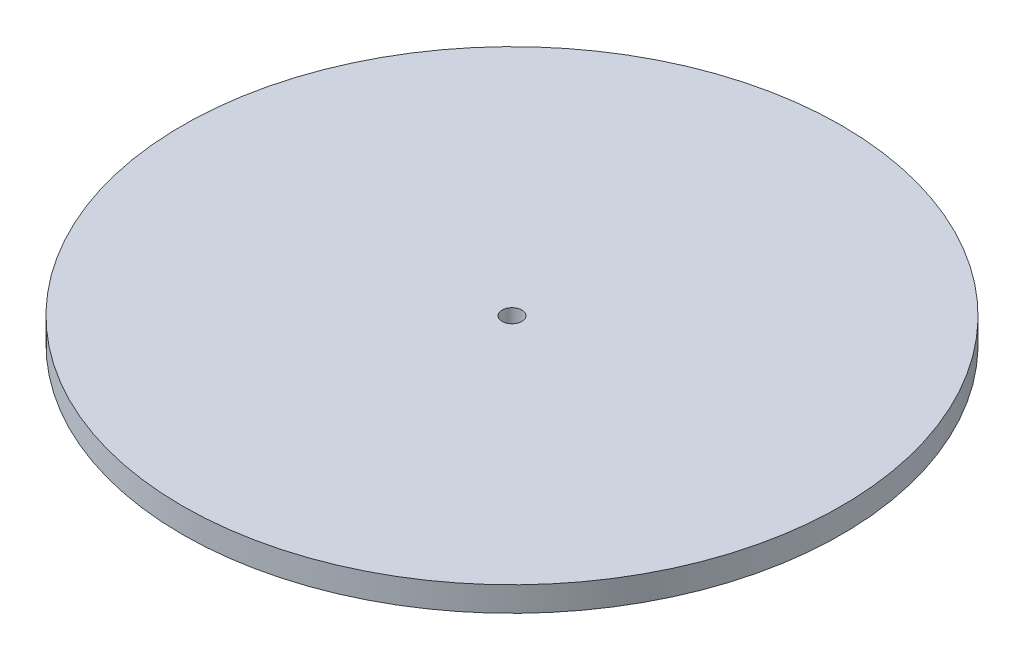
ISO-10303-21;
HEADER;
FILE_DESCRIPTION(('STEP AP214'),'2;1');
FILE_NAME('part.step','',(''),(''),'','','');
FILE_SCHEMA(('AUTOMOTIVE_DESIGN { 1 0 10303 214 1 1 1 1 }'));
ENDSEC;
DATA;
#1=APPLICATION_CONTEXT('core data for automotive mechanical design processes');
#2=APPLICATION_PROTOCOL_DEFINITION('international standard','automotive_design',2000,#1);
#3=PRODUCT_CONTEXT('',#1,'mechanical');
#4=PRODUCT('Part','Part','',(#3));
#5=PRODUCT_RELATED_PRODUCT_CATEGORY('part','',(#4));
#6=PRODUCT_DEFINITION_FORMATION('','',#4);
#7=PRODUCT_DEFINITION_CONTEXT('part definition',#1,'design');
#8=PRODUCT_DEFINITION('design','',#6,#7);
#9=PRODUCT_DEFINITION_SHAPE('','',#8);
#10=(LENGTH_UNIT() NAMED_UNIT(*) SI_UNIT(.MILLI.,.METRE.));
#11=(NAMED_UNIT(*) PLANE_ANGLE_UNIT() SI_UNIT($,.RADIAN.));
#12=(NAMED_UNIT(*) SI_UNIT($,.STERADIAN.) SOLID_ANGLE_UNIT());
#13=UNCERTAINTY_MEASURE_WITH_UNIT(LENGTH_MEASURE(1.E-05),#10,'distance_accuracy_value','');
#14=(GEOMETRIC_REPRESENTATION_CONTEXT(3) GLOBAL_UNCERTAINTY_ASSIGNED_CONTEXT((#13)) GLOBAL_UNIT_ASSIGNED_CONTEXT((#10,
#11,#12)) REPRESENTATION_CONTEXT('',''));
#15=CARTESIAN_POINT('',(0.,0.,0.));
#16=DIRECTION('',(0.,0.,1.));
#17=DIRECTION('',(1.,0.,0.));
#18=AXIS2_PLACEMENT_3D('',#15,#16,#17);
#19=CARTESIAN_POINT('',(0.,10.8230265143827,0.));
#20=DIRECTION('',(0.,1.,0.));
#21=DIRECTION('',(0.,0.,1.));
#22=AXIS2_PLACEMENT_3D('',#19,#20,#21);
#23=CYLINDRICAL_SURFACE('',#22,40.);
#24=CARTESIAN_POINT('',(0.,10.8230265143827,0.));
#25=DIRECTION('',(0.,1.,0.));
#26=DIRECTION('',(0.,0.,1.));
#27=AXIS2_PLACEMENT_3D('',#24,#25,#26);
#28=CIRCLE('',#27,40.);
#29=CARTESIAN_POINT('',(0.,10.8230265143827,40.));
#30=VERTEX_POINT('',#29);
#31=EDGE_CURVE('E50',#30,#30,#28,.T.);
#32=ORIENTED_EDGE('',*,*,#31,.F.);
#33=EDGE_LOOP('',(#32));
#34=FACE_BOUND('',#33,.T.);
#35=CARTESIAN_POINT('',(0.,7.82302651438274,0.));
#36=DIRECTION('',(0.,1.,0.));
#37=DIRECTION('',(0.,0.,1.));
#38=AXIS2_PLACEMENT_3D('',#35,#36,#37);
#39=CIRCLE('',#38,40.);
#40=CARTESIAN_POINT('',(0.,7.82302651438274,40.));
#41=VERTEX_POINT('',#40);
#42=EDGE_CURVE('E10',#41,#41,#39,.T.);
#43=ORIENTED_EDGE('',*,*,#42,.T.);
#44=EDGE_LOOP('',(#43));
#45=FACE_BOUND('',#44,.T.);
#46=ADVANCED_FACE('F31',(#34,#45),#23,.T.);
#47=CARTESIAN_POINT('',(37.,7.82302651438274,0.));
#48=DIRECTION('',(0.,1.,0.));
#49=DIRECTION('',(0.,0.,1.));
#50=AXIS2_PLACEMENT_3D('',#47,#48,#49);
#51=PLANE('',#50);
#52=ORIENTED_EDGE('',*,*,#42,.F.);
#53=EDGE_LOOP('',(#52));
#54=FACE_BOUND('',#53,.T.);
#55=CARTESIAN_POINT('',(0.,7.82302651438274,0.));
#56=DIRECTION('',(0.,1.,0.));
#57=DIRECTION('',(0.,0.,1.));
#58=AXIS2_PLACEMENT_3D('',#55,#56,#57);
#59=CIRCLE('',#58,37.);
#60=CARTESIAN_POINT('',(0.,7.82302651438274,37.));
#61=VERTEX_POINT('',#60);
#62=EDGE_CURVE('E37',#61,#61,#59,.T.);
#63=ORIENTED_EDGE('',*,*,#62,.T.);
#64=EDGE_LOOP('',(#63));
#65=FACE_BOUND('',#64,.T.);
#66=ADVANCED_FACE('F71',(#54,#65),#51,.F.);
#67=CARTESIAN_POINT('',(0.,10.8230265143827,0.));
#68=DIRECTION('',(0.,1.,0.));
#69=DIRECTION('',(0.,0.,1.));
#70=AXIS2_PLACEMENT_3D('',#67,#68,#69);
#71=CYLINDRICAL_SURFACE('',#70,37.);
#72=ORIENTED_EDGE('',*,*,#62,.F.);
#73=EDGE_LOOP('',(#72));
#74=FACE_BOUND('',#73,.T.);
#75=CARTESIAN_POINT('',(0.,6.82302651438273,0.));
#76=DIRECTION('',(0.,1.,0.));
#77=DIRECTION('',(0.,0.,1.));
#78=AXIS2_PLACEMENT_3D('',#75,#76,#77);
#79=CIRCLE('',#78,37.);
#80=CARTESIAN_POINT('',(0.,6.82302651438273,37.));
#81=VERTEX_POINT('',#80);
#82=EDGE_CURVE('E41',#81,#81,#79,.T.);
#83=ORIENTED_EDGE('',*,*,#82,.T.);
#84=EDGE_LOOP('',(#83));
#85=FACE_BOUND('',#84,.T.);
#86=ADVANCED_FACE('F67',(#74,#85),#71,.T.);
#87=CARTESIAN_POINT('',(5.13721552276858E-11,0.,0.));
#88=CARTESIAN_POINT('',(4.62499999902719,0.00114500511003094,0.));
#89=CARTESIAN_POINT('',(9.24999999851228,0.428491039827465,0.));
#90=CARTESIAN_POINT('',(13.8749999985571,1.32427928506071,0.));
#91=CARTESIAN_POINT('',(18.4999999987505,2.34432484301051,0.));
#92=CARTESIAN_POINT('',(23.1249999990352,3.44087033138319,0.));
#93=CARTESIAN_POINT('',(27.7499999993592,4.57026890870527,0.));
#94=CARTESIAN_POINT('',(32.3749999996839,5.70023002309265,0.));
#95=CARTESIAN_POINT('',(37.,6.82302651438273,0.));
#96=B_SPLINE_CURVE_WITH_KNOTS('',8,(#87,#88,#89,#90,#91,#92,#93,#94,#95),.UNSPECIFIED.,.F.,.F.,
(9,9),(0.0834030601831443,0.917433661794909),.UNSPECIFIED.);
#97=CARTESIAN_POINT('',(0.,10.8230265143827,0.));
#98=DIRECTION('',(0.,1.,0.));
#99=AXIS1_PLACEMENT('',#97,#98);
#100=SURFACE_OF_REVOLUTION('',#96,#99);
#101=CARTESIAN_POINT('',(0.,0.0129017315695645,0.));
#102=DIRECTION('',(0.,1.,0.));
#103=DIRECTION('',(0.,0.,1.));
#104=AXIS2_PLACEMENT_3D('',#101,#102,#103);
#105=CIRCLE('',#104,1.2);
#106=CARTESIAN_POINT('',(0.,0.0129017315695645,1.2));
#107=VERTEX_POINT('',#106);
#108=EDGE_CURVE('E53',#107,#107,#105,.T.);
#109=ORIENTED_EDGE('',*,*,#108,.T.);
#110=EDGE_LOOP('',(#109));
#111=FACE_BOUND('',#110,.T.);
#112=ORIENTED_EDGE('',*,*,#82,.F.);
#113=EDGE_LOOP('',(#112));
#114=FACE_BOUND('',#113,.T.);
#115=ADVANCED_FACE('F62',(#111,#114),#100,.T.);
#116=CARTESIAN_POINT('',(0.,10.8230265143827,0.));
#117=DIRECTION('',(0.,1.,0.));
#118=DIRECTION('',(0.,0.,1.));
#119=AXIS2_PLACEMENT_3D('',#116,#117,#118);
#120=CYLINDRICAL_SURFACE('',#119,1.2);
#121=CARTESIAN_POINT('',(0.,10.8230265143827,0.));
#122=DIRECTION('',(0.,1.,0.));
#123=DIRECTION('',(0.,0.,1.));
#124=AXIS2_PLACEMENT_3D('',#121,#122,#123);
#125=CIRCLE('',#124,1.2);
#126=CARTESIAN_POINT('',(0.,10.8230265143827,1.2));
#127=VERTEX_POINT('',#126);
#128=EDGE_CURVE('E45',#127,#127,#125,.T.);
#129=ORIENTED_EDGE('',*,*,#128,.T.);
#130=EDGE_LOOP('',(#129));
#131=FACE_BOUND('',#130,.T.);
#132=ORIENTED_EDGE('',*,*,#108,.F.);
#133=EDGE_LOOP('',(#132));
#134=FACE_BOUND('',#133,.T.);
#135=ADVANCED_FACE('F66',(#131,#134),#120,.F.);
#136=CARTESIAN_POINT('',(40.,10.8230265143827,0.));
#137=DIRECTION('',(0.,-1.,0.));
#138=DIRECTION('',(0.,0.,-1.));
#139=AXIS2_PLACEMENT_3D('',#136,#137,#138);
#140=PLANE('',#139);
#141=ORIENTED_EDGE('',*,*,#128,.F.);
#142=EDGE_LOOP('',(#141));
#143=FACE_BOUND('',#142,.T.);
#144=ORIENTED_EDGE('',*,*,#31,.T.);
#145=EDGE_LOOP('',(#144));
#146=FACE_BOUND('',#145,.T.);
#147=ADVANCED_FACE('F83',(#143,#146),#140,.F.);
#148=CLOSED_SHELL('',(#46,#66,#86,#115,#135,#147));
#149=MANIFOLD_SOLID_BREP('B2',#148);
#150=ADVANCED_BREP_SHAPE_REPRESENTATION('',(#18,#149),#14);
#151=SHAPE_DEFINITION_REPRESENTATION(#9,#150);
ENDSEC;
END-ISO-10303-21;
